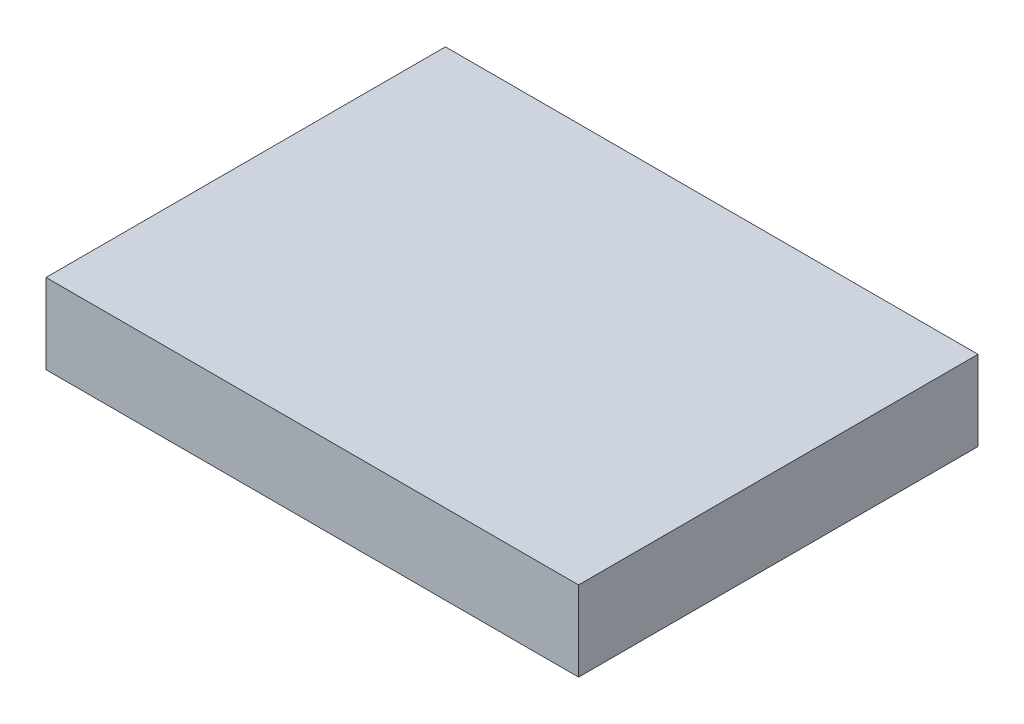
ISO-10303-21;
HEADER;
FILE_DESCRIPTION(('STEP AP214'),'2;1');
FILE_NAME('part.step','',(''),(''),'','','');
FILE_SCHEMA(('AUTOMOTIVE_DESIGN { 1 0 10303 214 1 1 1 1 }'));
ENDSEC;
DATA;
#1=APPLICATION_CONTEXT('core data for automotive mechanical design processes');
#2=APPLICATION_PROTOCOL_DEFINITION('international standard','automotive_design',2000,#1);
#3=PRODUCT_CONTEXT('',#1,'mechanical');
#4=PRODUCT('Part','Part','',(#3));
#5=PRODUCT_RELATED_PRODUCT_CATEGORY('part','',(#4));
#6=PRODUCT_DEFINITION_FORMATION('','',#4);
#7=PRODUCT_DEFINITION_CONTEXT('part definition',#1,'design');
#8=PRODUCT_DEFINITION('design','',#6,#7);
#9=PRODUCT_DEFINITION_SHAPE('','',#8);
#10=(LENGTH_UNIT() NAMED_UNIT(*) SI_UNIT(.MILLI.,.METRE.));
#11=(NAMED_UNIT(*) PLANE_ANGLE_UNIT() SI_UNIT($,.RADIAN.));
#12=(NAMED_UNIT(*) SI_UNIT($,.STERADIAN.) SOLID_ANGLE_UNIT());
#13=UNCERTAINTY_MEASURE_WITH_UNIT(LENGTH_MEASURE(1.E-05),#10,'distance_accuracy_value','');
#14=(GEOMETRIC_REPRESENTATION_CONTEXT(3) GLOBAL_UNCERTAINTY_ASSIGNED_CONTEXT((#13)) GLOBAL_UNIT_ASSIGNED_CONTEXT((#10,
#11,#12)) REPRESENTATION_CONTEXT('',''));
#15=CARTESIAN_POINT('',(0.,0.,0.));
#16=DIRECTION('',(0.,0.,1.));
#17=DIRECTION('',(1.,0.,0.));
#18=AXIS2_PLACEMENT_3D('',#15,#16,#17);
#19=CARTESIAN_POINT('',(-254.,76.2,-190.5));
#20=DIRECTION('',(1.,0.,0.));
#21=DIRECTION('',(0.,0.,-1.));
#22=AXIS2_PLACEMENT_3D('',#19,#20,#21);
#23=PLANE('',#22);
#24=DIRECTION('',(0.,0.,1.));
#25=VECTOR('',#24,1.);
#26=CARTESIAN_POINT('',(-254.,0.,-190.5));
#27=LINE('',#26,#25);
#28=CARTESIAN_POINT('',(-254.,0.,-190.5));
#29=VERTEX_POINT('',#28);
#30=CARTESIAN_POINT('',(-254.,0.,190.5));
#31=VERTEX_POINT('',#30);
#32=EDGE_CURVE('E95',#29,#31,#27,.T.);
#33=ORIENTED_EDGE('',*,*,#32,.T.);
#34=DIRECTION('',(0.,-1.,0.));
#35=VECTOR('',#34,1.);
#36=CARTESIAN_POINT('',(-254.,76.2,190.5));
#37=LINE('',#36,#35);
#38=CARTESIAN_POINT('',(-254.,76.2,190.5));
#39=VERTEX_POINT('',#38);
#40=EDGE_CURVE('E11',#39,#31,#37,.T.);
#41=ORIENTED_EDGE('',*,*,#40,.F.);
#42=DIRECTION('',(0.,0.,1.));
#43=VECTOR('',#42,1.);
#44=CARTESIAN_POINT('',(-254.,76.2,-190.5));
#45=LINE('',#44,#43);
#46=CARTESIAN_POINT('',(-254.,76.2,-190.5));
#47=VERTEX_POINT('',#46);
#48=EDGE_CURVE('E83',#47,#39,#45,.T.);
#49=ORIENTED_EDGE('',*,*,#48,.F.);
#50=DIRECTION('',(0.,-1.,0.));
#51=VECTOR('',#50,1.);
#52=CARTESIAN_POINT('',(-254.,76.2,-190.5));
#53=LINE('',#52,#51);
#54=EDGE_CURVE('E91',#47,#29,#53,.T.);
#55=ORIENTED_EDGE('',*,*,#54,.T.);
#56=EDGE_LOOP('',(#33,#41,#49,#55));
#57=FACE_BOUND('',#56,.T.);
#58=ADVANCED_FACE('F32',(#57),#23,.F.);
#59=CARTESIAN_POINT('',(-254.,76.2,190.5));
#60=DIRECTION('',(0.,0.,-1.));
#61=DIRECTION('',(-1.,0.,0.));
#62=AXIS2_PLACEMENT_3D('',#59,#60,#61);
#63=PLANE('',#62);
#64=DIRECTION('',(1.,0.,0.));
#65=VECTOR('',#64,1.);
#66=CARTESIAN_POINT('',(-254.,0.,190.5));
#67=LINE('',#66,#65);
#68=CARTESIAN_POINT('',(254.,0.,190.5));
#69=VERTEX_POINT('',#68);
#70=EDGE_CURVE('E87',#31,#69,#67,.T.);
#71=ORIENTED_EDGE('',*,*,#70,.T.);
#72=DIRECTION('',(0.,-1.,0.));
#73=VECTOR('',#72,1.);
#74=CARTESIAN_POINT('',(254.,76.2,190.5));
#75=LINE('',#74,#73);
#76=CARTESIAN_POINT('',(254.,76.2,190.5));
#77=VERTEX_POINT('',#76);
#78=EDGE_CURVE('E40',#77,#69,#75,.T.);
#79=ORIENTED_EDGE('',*,*,#78,.F.);
#80=DIRECTION('',(1.,0.,0.));
#81=VECTOR('',#80,1.);
#82=CARTESIAN_POINT('',(-254.,76.2,190.5));
#83=LINE('',#82,#81);
#84=EDGE_CURVE('E78',#39,#77,#83,.T.);
#85=ORIENTED_EDGE('',*,*,#84,.F.);
#86=ORIENTED_EDGE('',*,*,#40,.T.);
#87=EDGE_LOOP('',(#71,#79,#85,#86));
#88=FACE_BOUND('',#87,.T.);
#89=ADVANCED_FACE('F86',(#88),#63,.F.);
#90=CARTESIAN_POINT('',(254.,76.2,-190.5));
#91=DIRECTION('',(-1.,0.,0.));
#92=DIRECTION('',(0.,0.,1.));
#93=AXIS2_PLACEMENT_3D('',#90,#91,#92);
#94=PLANE('',#93);
#95=DIRECTION('',(0.,0.,-1.));
#96=VECTOR('',#95,1.);
#97=CARTESIAN_POINT('',(254.,0.,-190.5));
#98=LINE('',#97,#96);
#99=CARTESIAN_POINT('',(254.,0.,-190.5));
#100=VERTEX_POINT('',#99);
#101=EDGE_CURVE('E65',#69,#100,#98,.T.);
#102=ORIENTED_EDGE('',*,*,#101,.T.);
#103=DIRECTION('',(0.,-1.,0.));
#104=VECTOR('',#103,1.);
#105=CARTESIAN_POINT('',(254.,76.2,-190.5));
#106=LINE('',#105,#104);
#107=CARTESIAN_POINT('',(254.,76.2,-190.5));
#108=VERTEX_POINT('',#107);
#109=EDGE_CURVE('E88',#108,#100,#106,.T.);
#110=ORIENTED_EDGE('',*,*,#109,.F.);
#111=DIRECTION('',(0.,0.,-1.));
#112=VECTOR('',#111,1.);
#113=CARTESIAN_POINT('',(254.,76.2,-190.5));
#114=LINE('',#113,#112);
#115=EDGE_CURVE('E81',#77,#108,#114,.T.);
#116=ORIENTED_EDGE('',*,*,#115,.F.);
#117=ORIENTED_EDGE('',*,*,#78,.T.);
#118=EDGE_LOOP('',(#102,#110,#116,#117));
#119=FACE_BOUND('',#118,.T.);
#120=ADVANCED_FACE('F89',(#119),#94,.F.);
#121=CARTESIAN_POINT('',(-254.,76.2,-190.5));
#122=DIRECTION('',(0.,0.,1.));
#123=DIRECTION('',(1.,0.,0.));
#124=AXIS2_PLACEMENT_3D('',#121,#122,#123);
#125=PLANE('',#124);
#126=DIRECTION('',(-1.,0.,0.));
#127=VECTOR('',#126,1.);
#128=CARTESIAN_POINT('',(-254.,0.,-190.5));
#129=LINE('',#128,#127);
#130=EDGE_CURVE('E71',#100,#29,#129,.T.);
#131=ORIENTED_EDGE('',*,*,#130,.T.);
#132=ORIENTED_EDGE('',*,*,#54,.F.);
#133=DIRECTION('',(-1.,0.,0.));
#134=VECTOR('',#133,1.);
#135=CARTESIAN_POINT('',(-254.,76.2,-190.5));
#136=LINE('',#135,#134);
#137=EDGE_CURVE('E48',#108,#47,#136,.T.);
#138=ORIENTED_EDGE('',*,*,#137,.F.);
#139=ORIENTED_EDGE('',*,*,#109,.T.);
#140=EDGE_LOOP('',(#131,#132,#138,#139));
#141=FACE_BOUND('',#140,.T.);
#142=ADVANCED_FACE('F102',(#141),#125,.F.);
#143=CARTESIAN_POINT('',(0.,76.2,0.));
#144=DIRECTION('',(0.,1.,0.));
#145=DIRECTION('',(0.,0.,1.));
#146=AXIS2_PLACEMENT_3D('',#143,#144,#145);
#147=PLANE('',#146);
#148=ORIENTED_EDGE('',*,*,#48,.T.);
#149=ORIENTED_EDGE('',*,*,#84,.T.);
#150=ORIENTED_EDGE('',*,*,#115,.T.);
#151=ORIENTED_EDGE('',*,*,#137,.T.);
#152=EDGE_LOOP('',(#148,#149,#150,#151));
#153=FACE_BOUND('',#152,.T.);
#154=ADVANCED_FACE('F79',(#153),#147,.T.);
#155=CARTESIAN_POINT('',(0.,0.,0.));
#156=DIRECTION('',(0.,1.,0.));
#157=DIRECTION('',(0.,0.,1.));
#158=AXIS2_PLACEMENT_3D('',#155,#156,#157);
#159=PLANE('',#158);
#160=ORIENTED_EDGE('',*,*,#32,.F.);
#161=ORIENTED_EDGE('',*,*,#130,.F.);
#162=ORIENTED_EDGE('',*,*,#101,.F.);
#163=ORIENTED_EDGE('',*,*,#70,.F.);
#164=EDGE_LOOP('',(#160,#161,#162,#163));
#165=FACE_BOUND('',#164,.T.);
#166=ADVANCED_FACE('F105',(#165),#159,.F.);
#167=CLOSED_SHELL('',(#58,#89,#120,#142,#154,#166));
#168=MANIFOLD_SOLID_BREP('B2',#167);
#169=ADVANCED_BREP_SHAPE_REPRESENTATION('',(#18,#168),#14);
#170=SHAPE_DEFINITION_REPRESENTATION(#9,#169);
ENDSEC;
END-ISO-10303-21;
